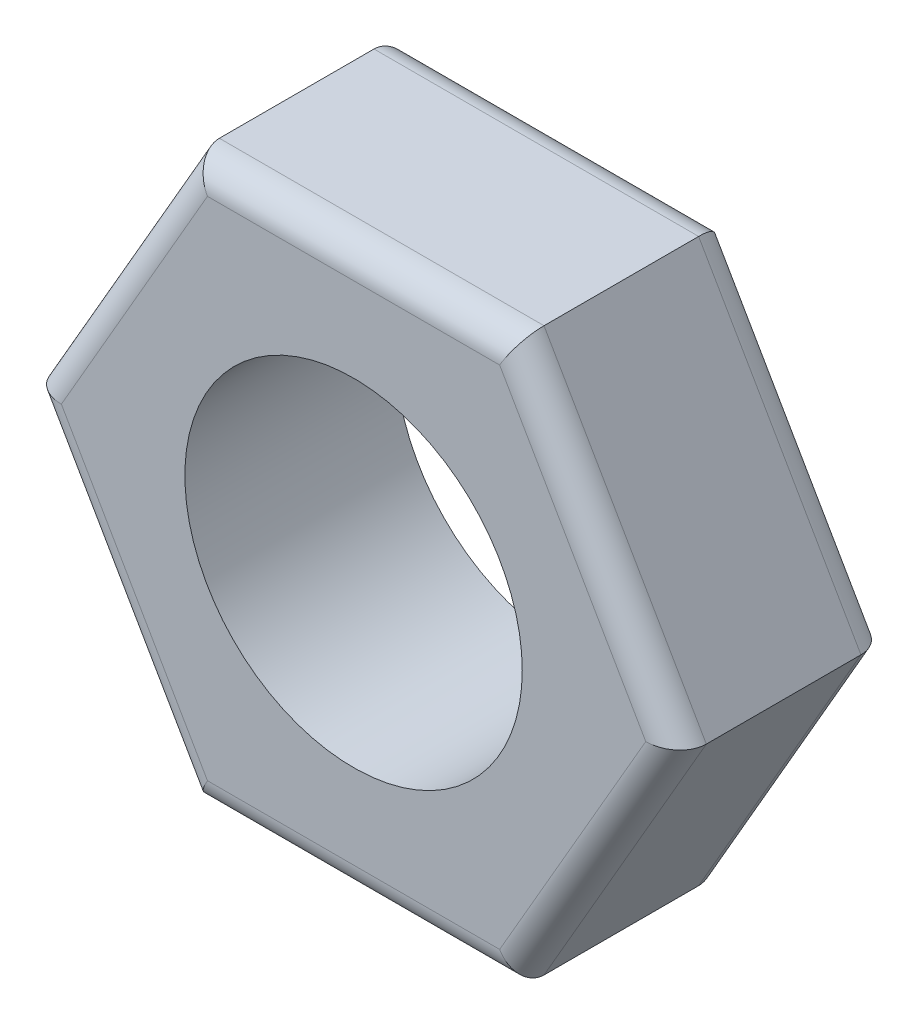
ISO-10303-21;
HEADER;
FILE_DESCRIPTION(('STEP AP214'),'2;1');
FILE_NAME('part.step','',(''),(''),'','','');
FILE_SCHEMA(('AUTOMOTIVE_DESIGN { 1 0 10303 214 1 1 1 1 }'));
ENDSEC;
DATA;
#1=APPLICATION_CONTEXT('core data for automotive mechanical design processes');
#2=APPLICATION_PROTOCOL_DEFINITION('international standard','automotive_design',2000,#1);
#3=PRODUCT_CONTEXT('',#1,'mechanical');
#4=PRODUCT('Part','Part','',(#3));
#5=PRODUCT_RELATED_PRODUCT_CATEGORY('part','',(#4));
#6=PRODUCT_DEFINITION_FORMATION('','',#4);
#7=PRODUCT_DEFINITION_CONTEXT('part definition',#1,'design');
#8=PRODUCT_DEFINITION('design','',#6,#7);
#9=PRODUCT_DEFINITION_SHAPE('','',#8);
#10=(LENGTH_UNIT() NAMED_UNIT(*) SI_UNIT(.MILLI.,.METRE.));
#11=(NAMED_UNIT(*) PLANE_ANGLE_UNIT() SI_UNIT($,.RADIAN.));
#12=(NAMED_UNIT(*) SI_UNIT($,.STERADIAN.) SOLID_ANGLE_UNIT());
#13=UNCERTAINTY_MEASURE_WITH_UNIT(LENGTH_MEASURE(1.E-05),#10,'distance_accuracy_value','');
#14=(GEOMETRIC_REPRESENTATION_CONTEXT(3) GLOBAL_UNCERTAINTY_ASSIGNED_CONTEXT((#13)) GLOBAL_UNIT_ASSIGNED_CONTEXT((#10,
#11,#12)) REPRESENTATION_CONTEXT('',''));
#15=CARTESIAN_POINT('',(0.,0.,0.));
#16=DIRECTION('',(0.,0.,1.));
#17=DIRECTION('',(1.,0.,0.));
#18=AXIS2_PLACEMENT_3D('',#15,#16,#17);
#19=CARTESIAN_POINT('',(-5.77350269189627,-10.,7.5));
#20=DIRECTION('',(0.,1.,0.));
#21=DIRECTION('',(-1.,0.,0.));
#22=AXIS2_PLACEMENT_3D('',#19,#20,#21);
#23=PLANE('',#22);
#24=DIRECTION('',(0.,0.,-1.));
#25=VECTOR('',#24,1.);
#26=CARTESIAN_POINT('',(-5.77350269189627,-10.,7.5));
#27=LINE('',#26,#25);
#28=CARTESIAN_POINT('',(-5.77350269189627,-10.,6.5));
#29=VERTEX_POINT('',#28);
#30=CARTESIAN_POINT('',(-5.77350269189627,-10.,1.));
#31=VERTEX_POINT('',#30);
#32=EDGE_CURVE('E176',#29,#31,#27,.T.);
#33=ORIENTED_EDGE('',*,*,#32,.T.);
#34=DIRECTION('',(1.,0.,0.));
#35=VECTOR('',#34,1.);
#36=CARTESIAN_POINT('',(-5.77350269189627,-10.,1.));
#37=LINE('',#36,#35);
#38=CARTESIAN_POINT('',(5.77350269189626,-10.,1.));
#39=VERTEX_POINT('',#38);
#40=EDGE_CURVE('E206',#31,#39,#37,.T.);
#41=ORIENTED_EDGE('',*,*,#40,.T.);
#42=DIRECTION('',(0.,0.,-1.));
#43=VECTOR('',#42,1.);
#44=CARTESIAN_POINT('',(5.77350269189626,-10.,7.5));
#45=LINE('',#44,#43);
#46=CARTESIAN_POINT('',(5.77350269189626,-10.,6.5));
#47=VERTEX_POINT('',#46);
#48=EDGE_CURVE('E158',#47,#39,#45,.T.);
#49=ORIENTED_EDGE('',*,*,#48,.F.);
#50=DIRECTION('',(1.,0.,0.));
#51=VECTOR('',#50,1.);
#52=CARTESIAN_POINT('',(-5.77350269189627,-10.,6.5));
#53=LINE('',#52,#51);
#54=EDGE_CURVE('E208',#47,#29,#53,.F.);
#55=ORIENTED_EDGE('',*,*,#54,.T.);
#56=EDGE_LOOP('',(#33,#41,#49,#55));
#57=FACE_BOUND('',#56,.T.);
#58=ADVANCED_FACE('F34',(#57),#23,.F.);
#59=CARTESIAN_POINT('',(5.77350269189626,-10.,7.5));
#60=DIRECTION('',(-0.866025403784439,0.5,0.));
#61=DIRECTION('',(-0.5,-0.866025403784439,0.));
#62=AXIS2_PLACEMENT_3D('',#59,#60,#61);
#63=PLANE('',#62);
#64=ORIENTED_EDGE('',*,*,#48,.T.);
#65=DIRECTION('',(0.5,0.866025403784439,0.));
#66=VECTOR('',#65,1.);
#67=CARTESIAN_POINT('',(5.77350269189626,-10.,1.));
#68=LINE('',#67,#66);
#69=CARTESIAN_POINT('',(11.5470053837925,0.,1.));
#70=VERTEX_POINT('',#69);
#71=EDGE_CURVE('E210',#39,#70,#68,.T.);
#72=ORIENTED_EDGE('',*,*,#71,.T.);
#73=DIRECTION('',(0.,0.,-1.));
#74=VECTOR('',#73,1.);
#75=CARTESIAN_POINT('',(11.5470053837925,0.,7.5));
#76=LINE('',#75,#74);
#77=CARTESIAN_POINT('',(11.5470053837925,0.,6.5));
#78=VERTEX_POINT('',#77);
#79=EDGE_CURVE('E148',#78,#70,#76,.T.);
#80=ORIENTED_EDGE('',*,*,#79,.F.);
#81=DIRECTION('',(0.5,0.866025403784439,0.));
#82=VECTOR('',#81,1.);
#83=CARTESIAN_POINT('',(5.77350269189626,-10.,6.5));
#84=LINE('',#83,#82);
#85=EDGE_CURVE('E212',#78,#47,#84,.F.);
#86=ORIENTED_EDGE('',*,*,#85,.T.);
#87=EDGE_LOOP('',(#64,#72,#80,#86));
#88=FACE_BOUND('',#87,.T.);
#89=ADVANCED_FACE('F267',(#88),#63,.F.);
#90=CARTESIAN_POINT('',(11.5470053837925,0.,7.5));
#91=DIRECTION('',(-0.866025403784439,-0.5,0.));
#92=DIRECTION('',(0.5,-0.866025403784439,0.));
#93=AXIS2_PLACEMENT_3D('',#90,#91,#92);
#94=PLANE('',#93);
#95=ORIENTED_EDGE('',*,*,#79,.T.);
#96=DIRECTION('',(-0.5,0.866025403784439,0.));
#97=VECTOR('',#96,1.);
#98=CARTESIAN_POINT('',(11.5470053837925,0.,1.));
#99=LINE('',#98,#97);
#100=CARTESIAN_POINT('',(5.77350269189626,10.,1.));
#101=VERTEX_POINT('',#100);
#102=EDGE_CURVE('E147',#70,#101,#99,.T.);
#103=ORIENTED_EDGE('',*,*,#102,.T.);
#104=DIRECTION('',(0.,0.,-1.));
#105=VECTOR('',#104,1.);
#106=CARTESIAN_POINT('',(5.77350269189626,10.,7.5));
#107=LINE('',#106,#105);
#108=CARTESIAN_POINT('',(5.77350269189626,10.,6.5));
#109=VERTEX_POINT('',#108);
#110=EDGE_CURVE('E129',#109,#101,#107,.T.);
#111=ORIENTED_EDGE('',*,*,#110,.F.);
#112=DIRECTION('',(-0.5,0.866025403784439,0.));
#113=VECTOR('',#112,1.);
#114=CARTESIAN_POINT('',(11.5470053837925,0.,6.5));
#115=LINE('',#114,#113);
#116=EDGE_CURVE('E144',#109,#78,#115,.F.);
#117=ORIENTED_EDGE('',*,*,#116,.T.);
#118=EDGE_LOOP('',(#95,#103,#111,#117));
#119=FACE_BOUND('',#118,.T.);
#120=ADVANCED_FACE('F143',(#119),#94,.F.);
#121=CARTESIAN_POINT('',(5.77350269189626,10.,7.5));
#122=DIRECTION('',(0.,-1.,0.));
#123=DIRECTION('',(0.,0.,-1.));
#124=AXIS2_PLACEMENT_3D('',#121,#122,#123);
#125=PLANE('',#124);
#126=ORIENTED_EDGE('',*,*,#110,.T.);
#127=DIRECTION('',(-1.,0.,0.));
#128=VECTOR('',#127,1.);
#129=CARTESIAN_POINT('',(5.77350269189626,10.,1.));
#130=LINE('',#129,#128);
#131=CARTESIAN_POINT('',(-5.77350269189626,10.,1.));
#132=VERTEX_POINT('',#131);
#133=EDGE_CURVE('E136',#101,#132,#130,.T.);
#134=ORIENTED_EDGE('',*,*,#133,.T.);
#135=DIRECTION('',(0.,0.,-1.));
#136=VECTOR('',#135,1.);
#137=CARTESIAN_POINT('',(-5.77350269189626,10.,7.5));
#138=LINE('',#137,#136);
#139=CARTESIAN_POINT('',(-5.77350269189626,10.,6.5));
#140=VERTEX_POINT('',#139);
#141=EDGE_CURVE('E131',#140,#132,#138,.T.);
#142=ORIENTED_EDGE('',*,*,#141,.F.);
#143=DIRECTION('',(-1.,0.,0.));
#144=VECTOR('',#143,1.);
#145=CARTESIAN_POINT('',(5.77350269189626,10.,6.5));
#146=LINE('',#145,#144);
#147=EDGE_CURVE('E126',#140,#109,#146,.F.);
#148=ORIENTED_EDGE('',*,*,#147,.T.);
#149=EDGE_LOOP('',(#126,#134,#142,#148));
#150=FACE_BOUND('',#149,.T.);
#151=ADVANCED_FACE('F128',(#150),#125,.F.);
#152=CARTESIAN_POINT('',(-5.77350269189626,10.,7.5));
#153=DIRECTION('',(0.866025403784439,-0.5,0.));
#154=DIRECTION('',(0.5,0.866025403784439,0.));
#155=AXIS2_PLACEMENT_3D('',#152,#153,#154);
#156=PLANE('',#155);
#157=ORIENTED_EDGE('',*,*,#141,.T.);
#158=DIRECTION('',(-0.5,-0.866025403784439,0.));
#159=VECTOR('',#158,1.);
#160=CARTESIAN_POINT('',(-5.77350269189626,10.,1.));
#161=LINE('',#160,#159);
#162=CARTESIAN_POINT('',(-11.5470053837925,0.,1.));
#163=VERTEX_POINT('',#162);
#164=EDGE_CURVE('E137',#132,#163,#161,.T.);
#165=ORIENTED_EDGE('',*,*,#164,.T.);
#166=DIRECTION('',(0.,0.,-1.));
#167=VECTOR('',#166,1.);
#168=CARTESIAN_POINT('',(-11.5470053837925,0.,7.5));
#169=LINE('',#168,#167);
#170=CARTESIAN_POINT('',(-11.5470053837925,0.,6.5));
#171=VERTEX_POINT('',#170);
#172=EDGE_CURVE('E232',#171,#163,#169,.T.);
#173=ORIENTED_EDGE('',*,*,#172,.F.);
#174=DIRECTION('',(-0.5,-0.866025403784439,0.));
#175=VECTOR('',#174,1.);
#176=CARTESIAN_POINT('',(-5.77350269189626,10.,6.5));
#177=LINE('',#176,#175);
#178=EDGE_CURVE('E200',#171,#140,#177,.F.);
#179=ORIENTED_EDGE('',*,*,#178,.T.);
#180=EDGE_LOOP('',(#157,#165,#173,#179));
#181=FACE_BOUND('',#180,.T.);
#182=ADVANCED_FACE('F332',(#181),#156,.F.);
#183=CARTESIAN_POINT('',(-11.5470053837925,0.,7.5));
#184=DIRECTION('',(0.866025403784439,0.5,0.));
#185=DIRECTION('',(-0.5,0.866025403784439,0.));
#186=AXIS2_PLACEMENT_3D('',#183,#184,#185);
#187=PLANE('',#186);
#188=ORIENTED_EDGE('',*,*,#172,.T.);
#189=DIRECTION('',(0.5,-0.866025403784439,0.));
#190=VECTOR('',#189,1.);
#191=CARTESIAN_POINT('',(-11.5470053837925,0.,1.));
#192=LINE('',#191,#190);
#193=EDGE_CURVE('E202',#163,#31,#192,.T.);
#194=ORIENTED_EDGE('',*,*,#193,.T.);
#195=ORIENTED_EDGE('',*,*,#32,.F.);
#196=DIRECTION('',(0.5,-0.866025403784439,0.));
#197=VECTOR('',#196,1.);
#198=CARTESIAN_POINT('',(-11.5470053837925,0.,6.5));
#199=LINE('',#198,#197);
#200=EDGE_CURVE('E204',#29,#171,#199,.F.);
#201=ORIENTED_EDGE('',*,*,#200,.T.);
#202=EDGE_LOOP('',(#188,#194,#195,#201));
#203=FACE_BOUND('',#202,.T.);
#204=ADVANCED_FACE('F255',(#203),#187,.F.);
#205=CARTESIAN_POINT('',(0.,0.,7.5));
#206=DIRECTION('',(0.,0.,1.));
#207=DIRECTION('',(1.,0.,0.));
#208=AXIS2_PLACEMENT_3D('',#205,#206,#207);
#209=PLANE('',#208);
#210=CARTESIAN_POINT('',(0.,0.,7.5));
#211=DIRECTION('',(0.,0.,1.));
#212=DIRECTION('',(1.,0.,0.));
#213=AXIS2_PLACEMENT_3D('',#210,#211,#212);
#214=CIRCLE('',#213,6.);
#215=CARTESIAN_POINT('',(6.,0.,7.5));
#216=VERTEX_POINT('',#215);
#217=EDGE_CURVE('E237',#216,#216,#214,.T.);
#218=ORIENTED_EDGE('',*,*,#217,.F.);
#219=EDGE_LOOP('',(#218));
#220=FACE_BOUND('',#219,.T.);
#221=DIRECTION('',(-1.,0.,0.));
#222=VECTOR('',#221,1.);
#223=CARTESIAN_POINT('',(-5.77350269189626,9.,7.5));
#224=LINE('',#223,#222);
#225=CARTESIAN_POINT('',(5.19615242270664,9.,7.5));
#226=VERTEX_POINT('',#225);
#227=CARTESIAN_POINT('',(-5.19615242270664,9.,7.5));
#228=VERTEX_POINT('',#227);
#229=EDGE_CURVE('E161',#226,#228,#224,.T.);
#230=ORIENTED_EDGE('',*,*,#229,.T.);
#231=DIRECTION('',(-0.5,-0.866025403784439,0.));
#232=VECTOR('',#231,1.);
#233=CARTESIAN_POINT('',(-10.6809799800081,-0.500000000000007,7.5));
#234=LINE('',#233,#232);
#235=CARTESIAN_POINT('',(-10.3923048454133,0.,7.5));
#236=VERTEX_POINT('',#235);
#237=EDGE_CURVE('E11',#228,#236,#234,.T.);
#238=ORIENTED_EDGE('',*,*,#237,.T.);
#239=DIRECTION('',(0.5,-0.866025403784439,0.));
#240=VECTOR('',#239,1.);
#241=CARTESIAN_POINT('',(-4.90747728811183,-9.5,7.5));
#242=LINE('',#241,#240);
#243=CARTESIAN_POINT('',(-5.19615242270664,-9.,7.5));
#244=VERTEX_POINT('',#243);
#245=EDGE_CURVE('E43',#236,#244,#242,.T.);
#246=ORIENTED_EDGE('',*,*,#245,.T.);
#247=DIRECTION('',(1.,0.,0.));
#248=VECTOR('',#247,1.);
#249=CARTESIAN_POINT('',(5.77350269189626,-9.,7.5));
#250=LINE('',#249,#248);
#251=CARTESIAN_POINT('',(5.19615242270663,-9.,7.5));
#252=VERTEX_POINT('',#251);
#253=EDGE_CURVE('E191',#244,#252,#250,.T.);
#254=ORIENTED_EDGE('',*,*,#253,.T.);
#255=DIRECTION('',(0.5,0.866025403784439,0.));
#256=VECTOR('',#255,1.);
#257=CARTESIAN_POINT('',(10.6809799800081,0.500000000000005,7.5));
#258=LINE('',#257,#256);
#259=CARTESIAN_POINT('',(10.3923048454133,0.,7.5));
#260=VERTEX_POINT('',#259);
#261=EDGE_CURVE('E193',#252,#260,#258,.T.);
#262=ORIENTED_EDGE('',*,*,#261,.T.);
#263=DIRECTION('',(-0.5,0.866025403784439,0.));
#264=VECTOR('',#263,1.);
#265=CARTESIAN_POINT('',(4.90747728811182,9.5,7.5));
#266=LINE('',#265,#264);
#267=EDGE_CURVE('E195',#260,#226,#266,.T.);
#268=ORIENTED_EDGE('',*,*,#267,.T.);
#269=EDGE_LOOP('',(#230,#238,#246,#254,#262,#268));
#270=FACE_BOUND('',#269,.T.);
#271=ADVANCED_FACE('F253',(#220,#270),#209,.T.);
#272=CARTESIAN_POINT('',(0.,0.,0.));
#273=DIRECTION('',(0.,0.,1.));
#274=DIRECTION('',(1.,0.,0.));
#275=AXIS2_PLACEMENT_3D('',#272,#273,#274);
#276=PLANE('',#275);
#277=CARTESIAN_POINT('',(0.,0.,0.));
#278=DIRECTION('',(0.,0.,1.));
#279=DIRECTION('',(1.,0.,0.));
#280=AXIS2_PLACEMENT_3D('',#277,#278,#279);
#281=CIRCLE('',#280,6.);
#282=CARTESIAN_POINT('',(6.,0.,0.));
#283=VERTEX_POINT('',#282);
#284=EDGE_CURVE('E172',#283,#283,#281,.T.);
#285=ORIENTED_EDGE('',*,*,#284,.T.);
#286=EDGE_LOOP('',(#285));
#287=FACE_BOUND('',#286,.T.);
#288=DIRECTION('',(-1.,0.,0.));
#289=VECTOR('',#288,1.);
#290=CARTESIAN_POINT('',(0.,9.,0.));
#291=LINE('',#290,#289);
#292=CARTESIAN_POINT('',(-5.19615242270663,9.,0.));
#293=VERTEX_POINT('',#292);
#294=CARTESIAN_POINT('',(5.19615242270664,9.,0.));
#295=VERTEX_POINT('',#294);
#296=EDGE_CURVE('E225',#293,#295,#291,.F.);
#297=ORIENTED_EDGE('',*,*,#296,.T.);
#298=DIRECTION('',(-0.5,0.866025403784439,0.));
#299=VECTOR('',#298,1.);
#300=CARTESIAN_POINT('',(7.79422863405995,4.5,0.));
#301=LINE('',#300,#299);
#302=CARTESIAN_POINT('',(10.3923048454133,0.,0.));
#303=VERTEX_POINT('',#302);
#304=EDGE_CURVE('E214',#295,#303,#301,.F.);
#305=ORIENTED_EDGE('',*,*,#304,.T.);
#306=DIRECTION('',(0.5,0.866025403784439,0.));
#307=VECTOR('',#306,1.);
#308=CARTESIAN_POINT('',(7.79422863405995,-4.5,0.));
#309=LINE('',#308,#307);
#310=CARTESIAN_POINT('',(5.19615242270663,-9.,0.));
#311=VERTEX_POINT('',#310);
#312=EDGE_CURVE('E217',#303,#311,#309,.F.);
#313=ORIENTED_EDGE('',*,*,#312,.T.);
#314=DIRECTION('',(1.,0.,0.));
#315=VECTOR('',#314,1.);
#316=CARTESIAN_POINT('',(0.,-9.,0.));
#317=LINE('',#316,#315);
#318=CARTESIAN_POINT('',(-5.19615242270664,-9.,0.));
#319=VERTEX_POINT('',#318);
#320=EDGE_CURVE('E219',#311,#319,#317,.F.);
#321=ORIENTED_EDGE('',*,*,#320,.T.);
#322=DIRECTION('',(0.5,-0.866025403784439,0.));
#323=VECTOR('',#322,1.);
#324=CARTESIAN_POINT('',(-7.79422863405996,-4.5,0.));
#325=LINE('',#324,#323);
#326=CARTESIAN_POINT('',(-10.3923048454133,0.,0.));
#327=VERTEX_POINT('',#326);
#328=EDGE_CURVE('E221',#319,#327,#325,.F.);
#329=ORIENTED_EDGE('',*,*,#328,.T.);
#330=DIRECTION('',(-0.5,-0.866025403784439,0.));
#331=VECTOR('',#330,1.);
#332=CARTESIAN_POINT('',(-7.79422863405995,4.5,0.));
#333=LINE('',#332,#331);
#334=EDGE_CURVE('E223',#327,#293,#333,.F.);
#335=ORIENTED_EDGE('',*,*,#334,.T.);
#336=EDGE_LOOP('',(#297,#305,#313,#321,#329,#335));
#337=FACE_BOUND('',#336,.T.);
#338=ADVANCED_FACE('F243',(#287,#337),#276,.F.);
#339=CARTESIAN_POINT('',(-10.6809799800081,0.499999999999993,1.));
#340=DIRECTION('',(0.5,-0.866025403784439,0.));
#341=DIRECTION('',(0.866025403784439,0.5,0.));
#342=AXIS2_PLACEMENT_3D('',#339,#340,#341);
#343=CYLINDRICAL_SURFACE('',#342,1.);
#344=CARTESIAN_POINT('',(-10.3923048454133,0.,1.));
#345=DIRECTION('',(0.,-1.,0.));
#346=DIRECTION('',(-1.,0.,0.));
#347=AXIS2_PLACEMENT_3D('',#344,#345,#346);
#348=ELLIPSE('',#347,1.15470053837925,1.);
#349=EDGE_CURVE('E177',#327,#163,#348,.F.);
#350=ORIENTED_EDGE('',*,*,#349,.F.);
#351=ORIENTED_EDGE('',*,*,#328,.F.);
#352=CARTESIAN_POINT('',(-5.19615242270664,-9.,1.));
#353=DIRECTION('',(0.866025403784439,-0.5,0.));
#354=DIRECTION('',(-0.5,-0.866025403784439,0.));
#355=AXIS2_PLACEMENT_3D('',#352,#353,#354);
#356=ELLIPSE('',#355,1.15470053837925,1.);
#357=EDGE_CURVE('E173',#31,#319,#356,.T.);
#358=ORIENTED_EDGE('',*,*,#357,.F.);
#359=ORIENTED_EDGE('',*,*,#193,.F.);
#360=EDGE_LOOP('',(#350,#351,#358,#359));
#361=FACE_BOUND('',#360,.T.);
#362=ADVANCED_FACE('F295',(#361),#343,.T.);
#363=CARTESIAN_POINT('',(-5.77350269189627,-9.,1.));
#364=DIRECTION('',(1.,0.,0.));
#365=DIRECTION('',(0.,1.,0.));
#366=AXIS2_PLACEMENT_3D('',#363,#364,#365);
#367=CYLINDRICAL_SURFACE('',#366,1.);
#368=ORIENTED_EDGE('',*,*,#357,.T.);
#369=ORIENTED_EDGE('',*,*,#320,.F.);
#370=CARTESIAN_POINT('',(5.19615242270663,-9.,1.));
#371=DIRECTION('',(0.866025403784439,0.5,0.));
#372=DIRECTION('',(0.5,-0.866025403784438,0.));
#373=AXIS2_PLACEMENT_3D('',#370,#371,#372);
#374=ELLIPSE('',#373,1.15470053837925,1.);
#375=EDGE_CURVE('E180',#39,#311,#374,.T.);
#376=ORIENTED_EDGE('',*,*,#375,.F.);
#377=ORIENTED_EDGE('',*,*,#40,.F.);
#378=EDGE_LOOP('',(#368,#369,#376,#377));
#379=FACE_BOUND('',#378,.T.);
#380=ADVANCED_FACE('F292',(#379),#367,.T.);
#381=CARTESIAN_POINT('',(-4.90747728811182,9.5,1.));
#382=DIRECTION('',(-0.5,-0.866025403784439,0.));
#383=DIRECTION('',(0.866025403784439,-0.5,0.));
#384=AXIS2_PLACEMENT_3D('',#381,#382,#383);
#385=CYLINDRICAL_SURFACE('',#384,1.);
#386=ORIENTED_EDGE('',*,*,#349,.T.);
#387=ORIENTED_EDGE('',*,*,#164,.F.);
#388=CARTESIAN_POINT('',(-5.19615242270663,9.,1.));
#389=DIRECTION('',(-0.866025403784439,-0.5,0.));
#390=DIRECTION('',(-0.5,0.866025403784439,0.));
#391=AXIS2_PLACEMENT_3D('',#388,#389,#390);
#392=ELLIPSE('',#391,1.15470053837925,1.);
#393=EDGE_CURVE('E183',#293,#132,#392,.F.);
#394=ORIENTED_EDGE('',*,*,#393,.F.);
#395=ORIENTED_EDGE('',*,*,#334,.F.);
#396=EDGE_LOOP('',(#386,#387,#394,#395));
#397=FACE_BOUND('',#396,.T.);
#398=ADVANCED_FACE('F288',(#397),#385,.T.);
#399=CARTESIAN_POINT('',(4.90747728811182,-9.5,1.));
#400=DIRECTION('',(0.5,0.866025403784439,0.));
#401=DIRECTION('',(-0.866025403784439,0.5,0.));
#402=AXIS2_PLACEMENT_3D('',#399,#400,#401);
#403=CYLINDRICAL_SURFACE('',#402,1.);
#404=ORIENTED_EDGE('',*,*,#375,.T.);
#405=ORIENTED_EDGE('',*,*,#312,.F.);
#406=CARTESIAN_POINT('',(10.3923048454133,0.,1.));
#407=DIRECTION('',(0.,1.,0.));
#408=DIRECTION('',(1.,0.,0.));
#409=AXIS2_PLACEMENT_3D('',#406,#407,#408);
#410=ELLIPSE('',#409,1.15470053837925,1.);
#411=EDGE_CURVE('E186',#70,#303,#410,.T.);
#412=ORIENTED_EDGE('',*,*,#411,.F.);
#413=ORIENTED_EDGE('',*,*,#71,.F.);
#414=EDGE_LOOP('',(#404,#405,#412,#413));
#415=FACE_BOUND('',#414,.T.);
#416=ADVANCED_FACE('F284',(#415),#403,.T.);
#417=CARTESIAN_POINT('',(5.77350269189626,9.,1.));
#418=DIRECTION('',(-1.,0.,0.));
#419=DIRECTION('',(0.,0.,1.));
#420=AXIS2_PLACEMENT_3D('',#417,#418,#419);
#421=CYLINDRICAL_SURFACE('',#420,1.);
#422=ORIENTED_EDGE('',*,*,#393,.T.);
#423=ORIENTED_EDGE('',*,*,#133,.F.);
#424=CARTESIAN_POINT('',(5.19615242270663,9.,1.));
#425=DIRECTION('',(-0.866025403784439,0.5,0.));
#426=DIRECTION('',(-0.5,-0.866025403784439,0.));
#427=AXIS2_PLACEMENT_3D('',#424,#425,#426);
#428=ELLIPSE('',#427,1.15470053837925,1.);
#429=EDGE_CURVE('E188',#295,#101,#428,.F.);
#430=ORIENTED_EDGE('',*,*,#429,.F.);
#431=ORIENTED_EDGE('',*,*,#296,.F.);
#432=EDGE_LOOP('',(#422,#423,#430,#431));
#433=FACE_BOUND('',#432,.T.);
#434=ADVANCED_FACE('F280',(#433),#421,.T.);
#435=CARTESIAN_POINT('',(10.6809799800081,-0.499999999999995,1.));
#436=DIRECTION('',(-0.5,0.866025403784439,0.));
#437=DIRECTION('',(-0.866025403784439,-0.5,0.));
#438=AXIS2_PLACEMENT_3D('',#435,#436,#437);
#439=CYLINDRICAL_SURFACE('',#438,1.);
#440=ORIENTED_EDGE('',*,*,#411,.T.);
#441=ORIENTED_EDGE('',*,*,#304,.F.);
#442=ORIENTED_EDGE('',*,*,#429,.T.);
#443=ORIENTED_EDGE('',*,*,#102,.F.);
#444=EDGE_LOOP('',(#440,#441,#442,#443));
#445=FACE_BOUND('',#444,.T.);
#446=ADVANCED_FACE('F277',(#445),#439,.T.);
#447=CARTESIAN_POINT('',(7.79422863405995,-4.5,6.5));
#448=DIRECTION('',(-0.5,-0.866025403784439,0.));
#449=DIRECTION('',(0.866025403784439,-0.5,0.));
#450=AXIS2_PLACEMENT_3D('',#447,#448,#449);
#451=CYLINDRICAL_SURFACE('',#450,1.);
#452=CARTESIAN_POINT('',(5.19615242270663,-9.,6.5));
#453=DIRECTION('',(-0.866025403784439,-0.5,0.));
#454=DIRECTION('',(0.5,-0.866025403784438,0.));
#455=AXIS2_PLACEMENT_3D('',#452,#453,#454);
#456=ELLIPSE('',#455,1.15470053837925,1.);
#457=EDGE_CURVE('E162',#47,#252,#456,.T.);
#458=ORIENTED_EDGE('',*,*,#457,.F.);
#459=ORIENTED_EDGE('',*,*,#85,.F.);
#460=CARTESIAN_POINT('',(10.3923048454133,0.,6.5));
#461=DIRECTION('',(0.,-1.,0.));
#462=DIRECTION('',(1.,0.,0.));
#463=AXIS2_PLACEMENT_3D('',#460,#461,#462);
#464=ELLIPSE('',#463,1.15470053837925,1.);
#465=EDGE_CURVE('E38',#260,#78,#464,.F.);
#466=ORIENTED_EDGE('',*,*,#465,.F.);
#467=ORIENTED_EDGE('',*,*,#261,.F.);
#468=EDGE_LOOP('',(#458,#459,#466,#467));
#469=FACE_BOUND('',#468,.T.);
#470=ADVANCED_FACE('F36',(#469),#451,.T.);
#471=CARTESIAN_POINT('',(7.79422863405995,4.5,6.5));
#472=DIRECTION('',(0.5,-0.866025403784439,0.));
#473=DIRECTION('',(0.866025403784439,0.5,0.));
#474=AXIS2_PLACEMENT_3D('',#471,#472,#473);
#475=CYLINDRICAL_SURFACE('',#474,1.);
#476=ORIENTED_EDGE('',*,*,#465,.T.);
#477=ORIENTED_EDGE('',*,*,#116,.F.);
#478=CARTESIAN_POINT('',(5.19615242270663,9.,6.5));
#479=DIRECTION('',(0.866025403784439,-0.5,0.));
#480=DIRECTION('',(0.5,0.866025403784439,0.));
#481=AXIS2_PLACEMENT_3D('',#478,#479,#480);
#482=ELLIPSE('',#481,1.15470053837925,1.);
#483=EDGE_CURVE('E155',#226,#109,#482,.F.);
#484=ORIENTED_EDGE('',*,*,#483,.F.);
#485=ORIENTED_EDGE('',*,*,#267,.F.);
#486=EDGE_LOOP('',(#476,#477,#484,#485));
#487=FACE_BOUND('',#486,.T.);
#488=ADVANCED_FACE('F153',(#487),#475,.T.);
#489=CARTESIAN_POINT('',(0.,-9.,6.5));
#490=DIRECTION('',(-1.,0.,0.));
#491=DIRECTION('',(0.,-1.,0.));
#492=AXIS2_PLACEMENT_3D('',#489,#490,#491);
#493=CYLINDRICAL_SURFACE('',#492,1.);
#494=ORIENTED_EDGE('',*,*,#457,.T.);
#495=ORIENTED_EDGE('',*,*,#253,.F.);
#496=CARTESIAN_POINT('',(-5.19615242270664,-9.,6.5));
#497=DIRECTION('',(-0.866025403784439,0.5,0.));
#498=DIRECTION('',(-0.5,-0.866025403784439,0.));
#499=AXIS2_PLACEMENT_3D('',#496,#497,#498);
#500=ELLIPSE('',#499,1.15470053837925,1.);
#501=EDGE_CURVE('E163',#29,#244,#500,.T.);
#502=ORIENTED_EDGE('',*,*,#501,.F.);
#503=ORIENTED_EDGE('',*,*,#54,.F.);
#504=EDGE_LOOP('',(#494,#495,#502,#503));
#505=FACE_BOUND('',#504,.T.);
#506=ADVANCED_FACE('F327',(#505),#493,.T.);
#507=CARTESIAN_POINT('',(0.,9.,6.5));
#508=DIRECTION('',(1.,0.,0.));
#509=DIRECTION('',(0.,0.,-1.));
#510=AXIS2_PLACEMENT_3D('',#507,#508,#509);
#511=CYLINDRICAL_SURFACE('',#510,1.);
#512=ORIENTED_EDGE('',*,*,#483,.T.);
#513=ORIENTED_EDGE('',*,*,#147,.F.);
#514=CARTESIAN_POINT('',(-5.19615242270663,9.,6.5));
#515=DIRECTION('',(0.866025403784439,0.5,0.));
#516=DIRECTION('',(0.5,-0.866025403784439,0.));
#517=AXIS2_PLACEMENT_3D('',#514,#515,#516);
#518=ELLIPSE('',#517,1.15470053837925,1.);
#519=EDGE_CURVE('E167',#228,#140,#518,.F.);
#520=ORIENTED_EDGE('',*,*,#519,.F.);
#521=ORIENTED_EDGE('',*,*,#229,.F.);
#522=EDGE_LOOP('',(#512,#513,#520,#521));
#523=FACE_BOUND('',#522,.T.);
#524=ADVANCED_FACE('F160',(#523),#511,.T.);
#525=CARTESIAN_POINT('',(-7.79422863405996,-4.5,6.5));
#526=DIRECTION('',(-0.5,0.866025403784439,0.));
#527=DIRECTION('',(-0.866025403784439,-0.5,0.));
#528=AXIS2_PLACEMENT_3D('',#525,#526,#527);
#529=CYLINDRICAL_SURFACE('',#528,1.);
#530=ORIENTED_EDGE('',*,*,#501,.T.);
#531=ORIENTED_EDGE('',*,*,#245,.F.);
#532=CARTESIAN_POINT('',(-10.3923048454133,0.,6.5));
#533=DIRECTION('',(0.,1.,0.));
#534=DIRECTION('',(-1.,0.,0.));
#535=AXIS2_PLACEMENT_3D('',#532,#533,#534);
#536=ELLIPSE('',#535,1.15470053837925,1.);
#537=EDGE_CURVE('E51',#171,#236,#536,.T.);
#538=ORIENTED_EDGE('',*,*,#537,.F.);
#539=ORIENTED_EDGE('',*,*,#200,.F.);
#540=EDGE_LOOP('',(#530,#531,#538,#539));
#541=FACE_BOUND('',#540,.T.);
#542=ADVANCED_FACE('F258',(#541),#529,.T.);
#543=CARTESIAN_POINT('',(-7.79422863405995,4.5,6.5));
#544=DIRECTION('',(0.5,0.866025403784439,0.));
#545=DIRECTION('',(-0.866025403784439,0.5,0.));
#546=AXIS2_PLACEMENT_3D('',#543,#544,#545);
#547=CYLINDRICAL_SURFACE('',#546,1.);
#548=ORIENTED_EDGE('',*,*,#519,.T.);
#549=ORIENTED_EDGE('',*,*,#178,.F.);
#550=ORIENTED_EDGE('',*,*,#537,.T.);
#551=ORIENTED_EDGE('',*,*,#237,.F.);
#552=EDGE_LOOP('',(#548,#549,#550,#551));
#553=FACE_BOUND('',#552,.T.);
#554=ADVANCED_FACE('F249',(#553),#547,.T.);
#555=CARTESIAN_POINT('',(0.,0.,0.));
#556=DIRECTION('',(0.,0.,1.));
#557=DIRECTION('',(1.,0.,0.));
#558=AXIS2_PLACEMENT_3D('',#555,#556,#557);
#559=CYLINDRICAL_SURFACE('',#558,6.);
#560=ORIENTED_EDGE('',*,*,#284,.F.);
#561=EDGE_LOOP('',(#560));
#562=FACE_BOUND('',#561,.T.);
#563=ORIENTED_EDGE('',*,*,#217,.T.);
#564=EDGE_LOOP('',(#563));
#565=FACE_BOUND('',#564,.T.);
#566=ADVANCED_FACE('F246',(#562,#565),#559,.F.);
#567=CLOSED_SHELL('',(#58,#89,#120,#151,#182,#204,#271,#338,#362,#380,#398,#416,#434,#446,#470,
#488,#506,#524,#542,#554,#566));
#568=MANIFOLD_SOLID_BREP('B2',#567);
#569=ADVANCED_BREP_SHAPE_REPRESENTATION('',(#18,#568),#14);
#570=SHAPE_DEFINITION_REPRESENTATION(#9,#569);
ENDSEC;
END-ISO-10303-21;
